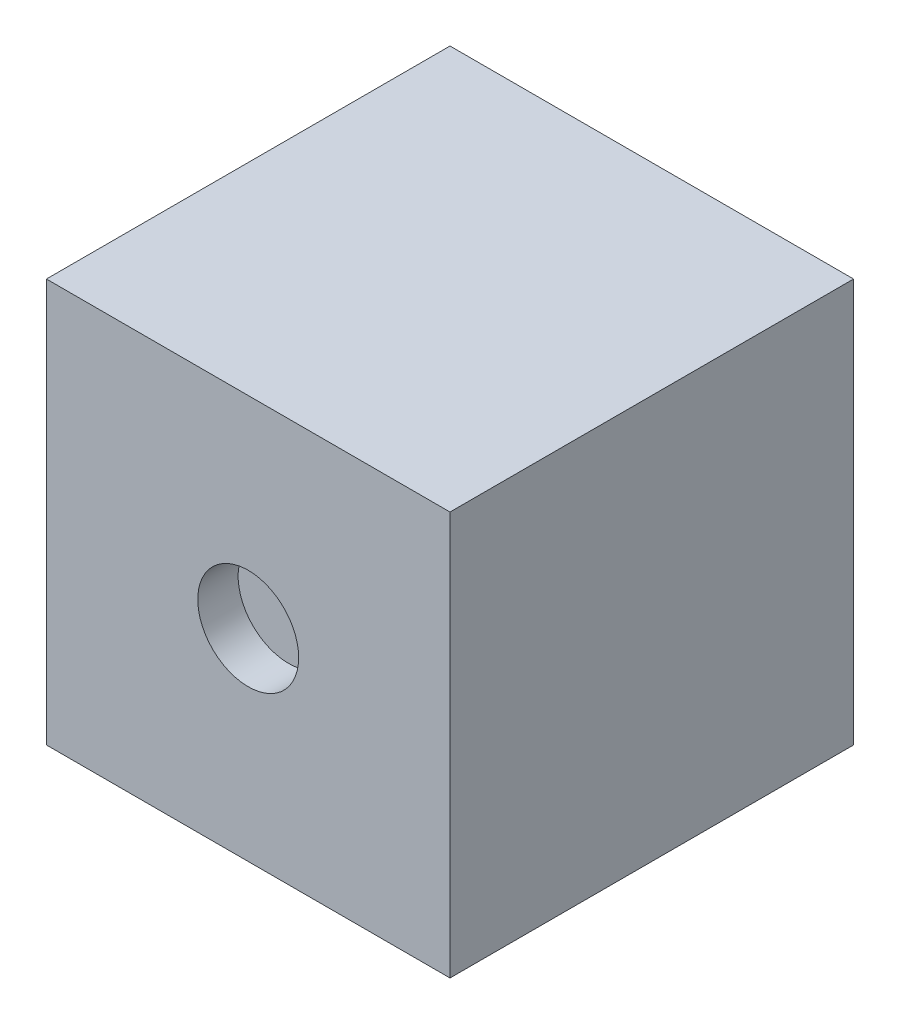
ISO-10303-21;
HEADER;
FILE_DESCRIPTION(('STEP AP214'),'2;1');
FILE_NAME('part.step','',(''),(''),'','','');
FILE_SCHEMA(('AUTOMOTIVE_DESIGN { 1 0 10303 214 1 1 1 1 }'));
ENDSEC;
DATA;
#1=APPLICATION_CONTEXT('core data for automotive mechanical design processes');
#2=APPLICATION_PROTOCOL_DEFINITION('international standard','automotive_design',2000,#1);
#3=PRODUCT_CONTEXT('',#1,'mechanical');
#4=PRODUCT('Part','Part','',(#3));
#5=PRODUCT_RELATED_PRODUCT_CATEGORY('part','',(#4));
#6=PRODUCT_DEFINITION_FORMATION('','',#4);
#7=PRODUCT_DEFINITION_CONTEXT('part definition',#1,'design');
#8=PRODUCT_DEFINITION('design','',#6,#7);
#9=PRODUCT_DEFINITION_SHAPE('','',#8);
#10=(LENGTH_UNIT() NAMED_UNIT(*) SI_UNIT(.MILLI.,.METRE.));
#11=(NAMED_UNIT(*) PLANE_ANGLE_UNIT() SI_UNIT($,.RADIAN.));
#12=(NAMED_UNIT(*) SI_UNIT($,.STERADIAN.) SOLID_ANGLE_UNIT());
#13=UNCERTAINTY_MEASURE_WITH_UNIT(LENGTH_MEASURE(1.E-05),#10,'distance_accuracy_value','');
#14=(GEOMETRIC_REPRESENTATION_CONTEXT(3) GLOBAL_UNCERTAINTY_ASSIGNED_CONTEXT((#13)) GLOBAL_UNIT_ASSIGNED_CONTEXT((#10,
#11,#12)) REPRESENTATION_CONTEXT('',''));
#15=CARTESIAN_POINT('',(0.,0.,0.));
#16=DIRECTION('',(0.,0.,1.));
#17=DIRECTION('',(1.,0.,0.));
#18=AXIS2_PLACEMENT_3D('',#15,#16,#17);
#19=CARTESIAN_POINT('',(0.,0.,-20.));
#20=DIRECTION('',(-1.,0.,0.));
#21=DIRECTION('',(0.,0.,1.));
#22=AXIS2_PLACEMENT_3D('',#19,#20,#21);
#23=PLANE('',#22);
#24=DIRECTION('',(0.,-1.,0.));
#25=VECTOR('',#24,1.);
#26=CARTESIAN_POINT('',(0.,0.,0.));
#27=LINE('',#26,#25);
#28=CARTESIAN_POINT('',(0.,20.,0.));
#29=VERTEX_POINT('',#28);
#30=CARTESIAN_POINT('',(0.,0.,0.));
#31=VERTEX_POINT('',#30);
#32=EDGE_CURVE('E114',#29,#31,#27,.T.);
#33=ORIENTED_EDGE('',*,*,#32,.F.);
#34=DIRECTION('',(0.,0.,1.));
#35=VECTOR('',#34,1.);
#36=CARTESIAN_POINT('',(0.,20.,-20.));
#37=LINE('',#36,#35);
#38=CARTESIAN_POINT('',(0.,20.,-20.));
#39=VERTEX_POINT('',#38);
#40=EDGE_CURVE('E11',#39,#29,#37,.T.);
#41=ORIENTED_EDGE('',*,*,#40,.F.);
#42=DIRECTION('',(0.,-1.,0.));
#43=VECTOR('',#42,1.);
#44=CARTESIAN_POINT('',(0.,0.,-20.));
#45=LINE('',#44,#43);
#46=CARTESIAN_POINT('',(0.,0.,-20.));
#47=VERTEX_POINT('',#46);
#48=EDGE_CURVE('E105',#39,#47,#45,.T.);
#49=ORIENTED_EDGE('',*,*,#48,.T.);
#50=DIRECTION('',(0.,0.,1.));
#51=VECTOR('',#50,1.);
#52=CARTESIAN_POINT('',(0.,0.,-20.));
#53=LINE('',#52,#51);
#54=EDGE_CURVE('E46',#47,#31,#53,.T.);
#55=ORIENTED_EDGE('',*,*,#54,.T.);
#56=EDGE_LOOP('',(#33,#41,#49,#55));
#57=FACE_BOUND('',#56,.T.);
#58=ADVANCED_FACE('F43',(#57),#23,.T.);
#59=CARTESIAN_POINT('',(0.,20.,-20.));
#60=DIRECTION('',(0.,1.,0.));
#61=DIRECTION('',(0.,0.,1.));
#62=AXIS2_PLACEMENT_3D('',#59,#60,#61);
#63=PLANE('',#62);
#64=DIRECTION('',(-1.,0.,0.));
#65=VECTOR('',#64,1.);
#66=CARTESIAN_POINT('',(0.,20.,0.));
#67=LINE('',#66,#65);
#68=CARTESIAN_POINT('',(20.,20.,0.));
#69=VERTEX_POINT('',#68);
#70=EDGE_CURVE('E108',#69,#29,#67,.T.);
#71=ORIENTED_EDGE('',*,*,#70,.F.);
#72=DIRECTION('',(0.,0.,1.));
#73=VECTOR('',#72,1.);
#74=CARTESIAN_POINT('',(20.,20.,-20.));
#75=LINE('',#74,#73);
#76=CARTESIAN_POINT('',(20.,20.,-20.));
#77=VERTEX_POINT('',#76);
#78=EDGE_CURVE('E53',#77,#69,#75,.T.);
#79=ORIENTED_EDGE('',*,*,#78,.F.);
#80=DIRECTION('',(-1.,0.,0.));
#81=VECTOR('',#80,1.);
#82=CARTESIAN_POINT('',(0.,20.,-20.));
#83=LINE('',#82,#81);
#84=EDGE_CURVE('E100',#77,#39,#83,.T.);
#85=ORIENTED_EDGE('',*,*,#84,.T.);
#86=ORIENTED_EDGE('',*,*,#40,.T.);
#87=EDGE_LOOP('',(#71,#79,#85,#86));
#88=FACE_BOUND('',#87,.T.);
#89=ADVANCED_FACE('F131',(#88),#63,.T.);
#90=CARTESIAN_POINT('',(20.,0.,-20.));
#91=DIRECTION('',(1.,0.,0.));
#92=DIRECTION('',(0.,0.,-1.));
#93=AXIS2_PLACEMENT_3D('',#90,#91,#92);
#94=PLANE('',#93);
#95=DIRECTION('',(0.,1.,0.));
#96=VECTOR('',#95,1.);
#97=CARTESIAN_POINT('',(20.,0.,0.));
#98=LINE('',#97,#96);
#99=CARTESIAN_POINT('',(20.,0.,0.));
#100=VERTEX_POINT('',#99);
#101=EDGE_CURVE('E94',#100,#69,#98,.T.);
#102=ORIENTED_EDGE('',*,*,#101,.F.);
#103=DIRECTION('',(0.,0.,1.));
#104=VECTOR('',#103,1.);
#105=CARTESIAN_POINT('',(20.,0.,-20.));
#106=LINE('',#105,#104);
#107=CARTESIAN_POINT('',(20.,0.,-20.));
#108=VERTEX_POINT('',#107);
#109=EDGE_CURVE('E89',#108,#100,#106,.T.);
#110=ORIENTED_EDGE('',*,*,#109,.F.);
#111=DIRECTION('',(0.,1.,0.));
#112=VECTOR('',#111,1.);
#113=CARTESIAN_POINT('',(20.,0.,-20.));
#114=LINE('',#113,#112);
#115=EDGE_CURVE('E92',#108,#77,#114,.T.);
#116=ORIENTED_EDGE('',*,*,#115,.T.);
#117=ORIENTED_EDGE('',*,*,#78,.T.);
#118=EDGE_LOOP('',(#102,#110,#116,#117));
#119=FACE_BOUND('',#118,.T.);
#120=ADVANCED_FACE('F91',(#119),#94,.T.);
#121=CARTESIAN_POINT('',(0.,0.,-20.));
#122=DIRECTION('',(0.,-1.,0.));
#123=DIRECTION('',(0.,0.,-1.));
#124=AXIS2_PLACEMENT_3D('',#121,#122,#123);
#125=PLANE('',#124);
#126=DIRECTION('',(1.,0.,0.));
#127=VECTOR('',#126,1.);
#128=CARTESIAN_POINT('',(0.,0.,0.));
#129=LINE('',#128,#127);
#130=EDGE_CURVE('E118',#31,#100,#129,.T.);
#131=ORIENTED_EDGE('',*,*,#130,.F.);
#132=ORIENTED_EDGE('',*,*,#54,.F.);
#133=DIRECTION('',(1.,0.,0.));
#134=VECTOR('',#133,1.);
#135=CARTESIAN_POINT('',(0.,0.,-20.));
#136=LINE('',#135,#134);
#137=EDGE_CURVE('E99',#47,#108,#136,.T.);
#138=ORIENTED_EDGE('',*,*,#137,.T.);
#139=ORIENTED_EDGE('',*,*,#109,.T.);
#140=EDGE_LOOP('',(#131,#132,#138,#139));
#141=FACE_BOUND('',#140,.T.);
#142=ADVANCED_FACE('F103',(#141),#125,.T.);
#143=CARTESIAN_POINT('',(0.,0.,-20.));
#144=DIRECTION('',(0.,0.,-1.));
#145=DIRECTION('',(-1.,0.,0.));
#146=AXIS2_PLACEMENT_3D('',#143,#144,#145);
#147=PLANE('',#146);
#148=ORIENTED_EDGE('',*,*,#48,.F.);
#149=ORIENTED_EDGE('',*,*,#84,.F.);
#150=ORIENTED_EDGE('',*,*,#115,.F.);
#151=ORIENTED_EDGE('',*,*,#137,.F.);
#152=EDGE_LOOP('',(#148,#149,#150,#151));
#153=FACE_BOUND('',#152,.T.);
#154=ADVANCED_FACE('F98',(#153),#147,.T.);
#155=CARTESIAN_POINT('',(0.,0.,0.));
#156=DIRECTION('',(0.,0.,-1.));
#157=DIRECTION('',(-1.,0.,0.));
#158=AXIS2_PLACEMENT_3D('',#155,#156,#157);
#159=PLANE('',#158);
#160=CARTESIAN_POINT('',(10.,10.,0.));
#161=DIRECTION('',(0.,0.,1.));
#162=DIRECTION('',(1.,0.,0.));
#163=AXIS2_PLACEMENT_3D('',#160,#161,#162);
#164=CIRCLE('',#163,2.5);
#165=CARTESIAN_POINT('',(12.5,10.,0.));
#166=VERTEX_POINT('',#165);
#167=EDGE_CURVE('E162',#166,#166,#164,.T.);
#168=ORIENTED_EDGE('',*,*,#167,.F.);
#169=EDGE_LOOP('',(#168));
#170=FACE_BOUND('',#169,.T.);
#171=ORIENTED_EDGE('',*,*,#32,.T.);
#172=ORIENTED_EDGE('',*,*,#130,.T.);
#173=ORIENTED_EDGE('',*,*,#101,.T.);
#174=ORIENTED_EDGE('',*,*,#70,.T.);
#175=EDGE_LOOP('',(#171,#172,#173,#174));
#176=FACE_BOUND('',#175,.T.);
#177=ADVANCED_FACE('F130',(#170,#176),#159,.F.);
#178=CARTESIAN_POINT('',(10.,10.,-2.));
#179=DIRECTION('',(0.,0.,1.));
#180=DIRECTION('',(1.,0.,0.));
#181=AXIS2_PLACEMENT_3D('',#178,#179,#180);
#182=CYLINDRICAL_SURFACE('',#181,2.5);
#183=CARTESIAN_POINT('',(10.,10.,-2.));
#184=DIRECTION('',(0.,0.,1.));
#185=DIRECTION('',(1.,0.,0.));
#186=AXIS2_PLACEMENT_3D('',#183,#184,#185);
#187=CIRCLE('',#186,2.5);
#188=CARTESIAN_POINT('',(12.5,10.,-2.));
#189=VERTEX_POINT('',#188);
#190=EDGE_CURVE('E119',#189,#189,#187,.T.);
#191=ORIENTED_EDGE('',*,*,#190,.F.);
#192=EDGE_LOOP('',(#191));
#193=FACE_BOUND('',#192,.T.);
#194=ORIENTED_EDGE('',*,*,#167,.T.);
#195=EDGE_LOOP('',(#194));
#196=FACE_BOUND('',#195,.T.);
#197=ADVANCED_FACE('F148',(#193,#196),#182,.F.);
#198=CARTESIAN_POINT('',(10.,10.,-2.));
#199=DIRECTION('',(0.,0.,1.));
#200=DIRECTION('',(1.,0.,0.));
#201=AXIS2_PLACEMENT_3D('',#198,#199,#200);
#202=PLANE('',#201);
#203=ORIENTED_EDGE('',*,*,#190,.T.);
#204=EDGE_LOOP('',(#203));
#205=FACE_BOUND('',#204,.T.);
#206=ADVANCED_FACE('F153',(#205),#202,.T.);
#207=CLOSED_SHELL('',(#58,#89,#120,#142,#154,#177,#197,#206));
#208=MANIFOLD_SOLID_BREP('B2',#207);
#209=ADVANCED_BREP_SHAPE_REPRESENTATION('',(#18,#208),#14);
#210=SHAPE_DEFINITION_REPRESENTATION(#9,#209);
ENDSEC;
END-ISO-10303-21;
